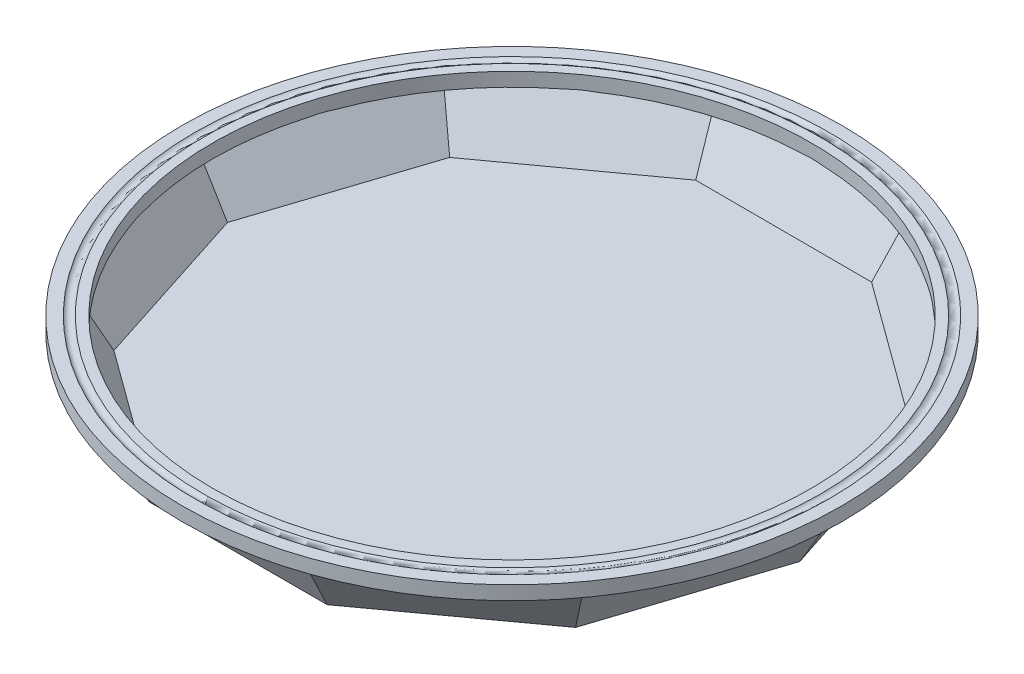
ISO-10303-21;
HEADER;
FILE_DESCRIPTION(('STEP AP214'),'2;1');
FILE_NAME('part.step','',(''),(''),'','','');
FILE_SCHEMA(('AUTOMOTIVE_DESIGN { 1 0 10303 214 1 1 1 1 }'));
ENDSEC;
DATA;
#1=APPLICATION_CONTEXT('core data for automotive mechanical design processes');
#2=APPLICATION_PROTOCOL_DEFINITION('international standard','automotive_design',2000,#1);
#3=PRODUCT_CONTEXT('',#1,'mechanical');
#4=PRODUCT('Part','Part','',(#3));
#5=PRODUCT_RELATED_PRODUCT_CATEGORY('part','',(#4));
#6=PRODUCT_DEFINITION_FORMATION('','',#4);
#7=PRODUCT_DEFINITION_CONTEXT('part definition',#1,'design');
#8=PRODUCT_DEFINITION('design','',#6,#7);
#9=PRODUCT_DEFINITION_SHAPE('','',#8);
#10=(LENGTH_UNIT() NAMED_UNIT(*) SI_UNIT(.MILLI.,.METRE.));
#11=(NAMED_UNIT(*) PLANE_ANGLE_UNIT() SI_UNIT($,.RADIAN.));
#12=(NAMED_UNIT(*) SI_UNIT($,.STERADIAN.) SOLID_ANGLE_UNIT());
#13=UNCERTAINTY_MEASURE_WITH_UNIT(LENGTH_MEASURE(1.E-05),#10,'distance_accuracy_value','');
#14=(GEOMETRIC_REPRESENTATION_CONTEXT(3) GLOBAL_UNCERTAINTY_ASSIGNED_CONTEXT((#13)) GLOBAL_UNIT_ASSIGNED_CONTEXT((#10,
#11,#12)) REPRESENTATION_CONTEXT('',''));
#15=CARTESIAN_POINT('',(0.,0.,0.));
#16=DIRECTION('',(0.,0.,1.));
#17=DIRECTION('',(1.,0.,0.));
#18=AXIS2_PLACEMENT_3D('',#15,#16,#17);
#19=CARTESIAN_POINT('',(0.,30.,0.));
#20=DIRECTION('',(0.,1.,0.));
#21=DIRECTION('',(0.,0.,1.));
#22=AXIS2_PLACEMENT_3D('',#19,#20,#21);
#23=PLANE('',#22);
#24=CARTESIAN_POINT('',(0.,30.,0.));
#25=DIRECTION('',(0.,1.,0.));
#26=DIRECTION('',(0.,0.,1.));
#27=AXIS2_PLACEMENT_3D('',#24,#25,#26);
#28=CIRCLE('',#27,143.211859946201);
#29=CARTESIAN_POINT('',(0.,30.,143.211859946201));
#30=VERTEX_POINT('',#29);
#31=EDGE_CURVE('E267',#30,#30,#28,.T.);
#32=ORIENTED_EDGE('',*,*,#31,.T.);
#33=EDGE_LOOP('',(#32));
#34=FACE_BOUND('',#33,.T.);
#35=CARTESIAN_POINT('',(0.,30.,0.));
#36=DIRECTION('',(0.,1.,0.));
#37=DIRECTION('',(0.,0.,1.));
#38=AXIS2_PLACEMENT_3D('',#35,#36,#37);
#39=CIRCLE('',#38,137.820311126304);
#40=CARTESIAN_POINT('',(137.82007156461,30.,0.256968630386883));
#41=VERTEX_POINT('',#40);
#42=EDGE_CURVE('E11',#41,#41,#39,.T.);
#43=ORIENTED_EDGE('',*,*,#42,.F.);
#44=EDGE_LOOP('',(#43));
#45=FACE_BOUND('',#44,.T.);
#46=ADVANCED_FACE('F35',(#34,#45),#23,.T.);
#47=CARTESIAN_POINT('',(101.127124296869,0.,73.4731565365584));
#48=DIRECTION('',(0.823639103546333,-0.500000000000001,0.267616567329811));
#49=DIRECTION('',(0.518927630227215,0.854818176331532,0.));
#50=AXIS2_PLACEMENT_3D('',#47,#48,#49);
#51=PLANE('',#50);
#52=DIRECTION('',(-0.309016994374941,0.,0.951056516295156));
#53=VECTOR('',#52,1.);
#54=CARTESIAN_POINT('',(114.30534995361,24.,77.7550216138354));
#55=LINE('',#54,#53);
#56=CARTESIAN_POINT('',(112.914087653391,24.,82.0368866911125));
#57=VERTEX_POINT('',#56);
#58=CARTESIAN_POINT('',(139.569487956961,24.,-1.01377953772939E-12));
#59=VERTEX_POINT('',#58);
#60=EDGE_CURVE('E363',#57,#59,#55,.F.);
#61=ORIENTED_EDGE('',*,*,#60,.F.);
#62=DIRECTION('',(-0.419821271704539,-0.854818176331531,-0.305018008054637));
#63=VECTOR('',#62,1.);
#64=CARTESIAN_POINT('',(101.127124296869,0.,73.4731565365584));
#65=LINE('',#64,#63);
#66=CARTESIAN_POINT('',(101.127124296869,0.,73.4731565365584));
#67=VERTEX_POINT('',#66);
#68=EDGE_CURVE('E454',#57,#67,#65,.T.);
#69=ORIENTED_EDGE('',*,*,#68,.T.);
#70=DIRECTION('',(0.309016994374941,0.,-0.951056516295156));
#71=VECTOR('',#70,1.);
#72=CARTESIAN_POINT('',(101.127124296869,0.,73.4731565365584));
#73=LINE('',#72,#71);
#74=CARTESIAN_POINT('',(125.,0.,-9.09773622481821E-13));
#75=VERTEX_POINT('',#74);
#76=EDGE_CURVE('E370',#67,#75,#73,.T.);
#77=ORIENTED_EDGE('',*,*,#76,.T.);
#78=DIRECTION('',(-0.518927630227216,-0.854818176331532,0.));
#79=VECTOR('',#78,1.);
#80=CARTESIAN_POINT('',(125.,0.,-9.03291499595016E-13));
#81=LINE('',#80,#79);
#82=EDGE_CURVE('E254',#59,#75,#81,.T.);
#83=ORIENTED_EDGE('',*,*,#82,.F.);
#84=EDGE_LOOP('',(#61,#69,#77,#83));
#85=FACE_BOUND('',#84,.T.);
#86=ADVANCED_FACE('F547',(#85),#51,.T.);
#87=CARTESIAN_POINT('',(125.,0.,-9.09773622481821E-13));
#88=DIRECTION('',(0.823639103546329,-0.500000000000001,-0.267616567329824));
#89=DIRECTION('',(0.518927630227217,0.854818176331531,0.));
#90=AXIS2_PLACEMENT_3D('',#87,#88,#89);
#91=PLANE('',#90);
#92=DIRECTION('',(0.309016994374955,0.,0.951056516295151));
#93=VECTOR('',#92,1.);
#94=CARTESIAN_POINT('',(138.178225656741,24.,-4.2818650772781));
#95=LINE('',#94,#93);
#96=CARTESIAN_POINT('',(112.91408765339,24.,-82.0368866911142));
#97=VERTEX_POINT('',#96);
#98=EDGE_CURVE('E360',#59,#97,#95,.F.);
#99=ORIENTED_EDGE('',*,*,#98,.F.);
#100=ORIENTED_EDGE('',*,*,#82,.T.);
#101=DIRECTION('',(-0.309016994374955,0.,-0.951056516295151));
#102=VECTOR('',#101,1.);
#103=CARTESIAN_POINT('',(125.,0.,-9.09773622481821E-13));
#104=LINE('',#103,#102);
#105=CARTESIAN_POINT('',(101.127124296868,0.,-73.4731565365599));
#106=VERTEX_POINT('',#105);
#107=EDGE_CURVE('E427',#75,#106,#104,.T.);
#108=ORIENTED_EDGE('',*,*,#107,.T.);
#109=DIRECTION('',(-0.419821271704534,-0.854818176331531,0.305018008054643));
#110=VECTOR('',#109,1.);
#111=CARTESIAN_POINT('',(101.127124296868,0.,-73.4731565365599));
#112=LINE('',#111,#110);
#113=EDGE_CURVE('E456',#97,#106,#112,.T.);
#114=ORIENTED_EDGE('',*,*,#113,.F.);
#115=EDGE_LOOP('',(#99,#100,#108,#114));
#116=FACE_BOUND('',#115,.T.);
#117=ADVANCED_FACE('F37',(#116),#91,.T.);
#118=CARTESIAN_POINT('',(101.127124296868,0.,-73.4731565365599));
#119=DIRECTION('',(0.509036960455122,-0.500000000000001,-0.70062926922204));
#120=DIRECTION('',(-0.809016994374951,0.,-0.587785252292468));
#121=AXIS2_PLACEMENT_3D('',#118,#119,#120);
#122=PLANE('',#121);
#123=DIRECTION('',(0.809016994374951,0.,0.587785252292468));
#124=VECTOR('',#123,1.);
#125=CARTESIAN_POINT('',(109.27171566415,24.,-84.6832248441126));
#126=LINE('',#125,#124);
#127=CARTESIAN_POINT('',(43.1293436749093,24.,-132.738470997446));
#128=VERTEX_POINT('',#127);
#129=EDGE_CURVE('E357',#97,#128,#126,.F.);
#130=ORIENTED_EDGE('',*,*,#129,.F.);
#131=ORIENTED_EDGE('',*,*,#113,.T.);
#132=DIRECTION('',(-0.809016994374951,0.,-0.587785252292468));
#133=VECTOR('',#132,1.);
#134=CARTESIAN_POINT('',(101.127124296868,0.,-73.4731565365599));
#135=LINE('',#134,#133);
#136=CARTESIAN_POINT('',(38.6271242968675,0.,-118.882064536895));
#137=VERTEX_POINT('',#136);
#138=EDGE_CURVE('E430',#106,#137,#135,.T.);
#139=ORIENTED_EDGE('',*,*,#138,.T.);
#140=DIRECTION('',(-0.160357456590925,-0.854818176331532,0.493529504213197));
#141=VECTOR('',#140,1.);
#142=CARTESIAN_POINT('',(38.6271242968675,0.,-118.882064536895));
#143=LINE('',#142,#141);
#144=EDGE_CURVE('E470',#128,#137,#143,.T.);
#145=ORIENTED_EDGE('',*,*,#144,.F.);
#146=EDGE_LOOP('',(#130,#131,#139,#145));
#147=FACE_BOUND('',#146,.T.);
#148=ADVANCED_FACE('F815',(#147),#122,.T.);
#149=CARTESIAN_POINT('',(38.6271242968675,0.,-118.882064536895));
#150=DIRECTION('',(0.,-0.500000000000001,-0.866025403784438));
#151=DIRECTION('',(0.,0.866025403784438,-0.500000000000001));
#152=AXIS2_PLACEMENT_3D('',#149,#150,#151);
#153=PLANE('',#152);
#154=DIRECTION('',(1.,0.,0.));
#155=VECTOR('',#154,1.);
#156=CARTESIAN_POINT('',(38.6271242968674,24.,-132.738470997446));
#157=LINE('',#156,#155);
#158=CARTESIAN_POINT('',(-43.1293436749114,24.,-132.738470997445));
#159=VERTEX_POINT('',#158);
#160=EDGE_CURVE('E354',#128,#159,#157,.F.);
#161=ORIENTED_EDGE('',*,*,#160,.F.);
#162=ORIENTED_EDGE('',*,*,#144,.T.);
#163=DIRECTION('',(-1.,0.,0.));
#164=VECTOR('',#163,1.);
#165=CARTESIAN_POINT('',(38.6271242968675,0.,-118.882064536895));
#166=LINE('',#165,#164);
#167=CARTESIAN_POINT('',(-38.6271242968694,0.,-118.882064536894));
#168=VERTEX_POINT('',#167);
#169=EDGE_CURVE('E433',#137,#168,#166,.T.);
#170=ORIENTED_EDGE('',*,*,#169,.T.);
#171=DIRECTION('',(0.160357456590933,-0.854818176331532,0.493529504213195));
#172=VECTOR('',#171,1.);
#173=CARTESIAN_POINT('',(-38.6271242968694,0.,-118.882064536894));
#174=LINE('',#173,#172);
#175=EDGE_CURVE('E468',#159,#168,#174,.T.);
#176=ORIENTED_EDGE('',*,*,#175,.F.);
#177=EDGE_LOOP('',(#161,#162,#170,#176));
#178=FACE_BOUND('',#177,.T.);
#179=ADVANCED_FACE('F805',(#178),#153,.T.);
#180=CARTESIAN_POINT('',(-38.6271242968694,0.,-118.882064536894));
#181=DIRECTION('',(-0.509036960455133,-0.500000000000001,-0.700629269222032));
#182=DIRECTION('',(-0.809016994374943,0.,0.58778525229248));
#183=AXIS2_PLACEMENT_3D('',#180,#181,#182);
#184=PLANE('',#183);
#185=DIRECTION('',(0.809016994374943,0.,-0.58778525229248));
#186=VECTOR('',#185,1.);
#187=CARTESIAN_POINT('',(-46.7717156641515,24.,-130.092132844447));
#188=LINE('',#187,#186);
#189=CARTESIAN_POINT('',(-112.914087653391,24.,-82.0368866911125));
#190=VERTEX_POINT('',#189);
#191=EDGE_CURVE('E351',#159,#190,#188,.F.);
#192=ORIENTED_EDGE('',*,*,#191,.F.);
#193=ORIENTED_EDGE('',*,*,#175,.T.);
#194=DIRECTION('',(-0.809016994374943,0.,0.58778525229248));
#195=VECTOR('',#194,1.);
#196=CARTESIAN_POINT('',(-38.6271242968694,0.,-118.882064536894));
#197=LINE('',#196,#195);
#198=CARTESIAN_POINT('',(-101.127124296869,0.,-73.4731565365584));
#199=VERTEX_POINT('',#198);
#200=EDGE_CURVE('E436',#168,#199,#197,.T.);
#201=ORIENTED_EDGE('',*,*,#200,.T.);
#202=DIRECTION('',(0.419821271704539,-0.854818176331531,0.305018008054636));
#203=VECTOR('',#202,1.);
#204=CARTESIAN_POINT('',(-101.127124296869,0.,-73.4731565365584));
#205=LINE('',#204,#203);
#206=EDGE_CURVE('E466',#190,#199,#205,.T.);
#207=ORIENTED_EDGE('',*,*,#206,.F.);
#208=EDGE_LOOP('',(#192,#193,#201,#207));
#209=FACE_BOUND('',#208,.T.);
#210=ADVANCED_FACE('F795',(#209),#184,.T.);
#211=CARTESIAN_POINT('',(-101.127124296869,0.,-73.4731565365584));
#212=DIRECTION('',(-0.823639103546333,-0.500000000000001,-0.267616567329811));
#213=DIRECTION('',(0.518927630227215,-0.854818176331532,0.));
#214=AXIS2_PLACEMENT_3D('',#211,#212,#213);
#215=PLANE('',#214);
#216=DIRECTION('',(0.309016994374941,0.,-0.951056516295156));
#217=VECTOR('',#216,1.);
#218=CARTESIAN_POINT('',(-114.30534995361,24.,-77.7550216138354));
#219=LINE('',#218,#217);
#220=CARTESIAN_POINT('',(-139.569487956961,24.,9.80287554470755E-13));
#221=VERTEX_POINT('',#220);
#222=EDGE_CURVE('E348',#190,#221,#219,.F.);
#223=ORIENTED_EDGE('',*,*,#222,.F.);
#224=ORIENTED_EDGE('',*,*,#206,.T.);
#225=DIRECTION('',(-0.309016994374941,0.,0.951056516295156));
#226=VECTOR('',#225,1.);
#227=CARTESIAN_POINT('',(-101.127124296869,0.,-73.4731565365584));
#228=LINE('',#227,#226);
#229=CARTESIAN_POINT('',(-125.,0.,8.7360674250192E-13));
#230=VERTEX_POINT('',#229);
#231=EDGE_CURVE('E439',#199,#230,#228,.T.);
#232=ORIENTED_EDGE('',*,*,#231,.T.);
#233=DIRECTION('',(0.518927630227216,-0.854818176331532,0.));
#234=VECTOR('',#233,1.);
#235=CARTESIAN_POINT('',(-125.,0.,8.7360674250192E-13));
#236=LINE('',#235,#234);
#237=EDGE_CURVE('E464',#221,#230,#236,.T.);
#238=ORIENTED_EDGE('',*,*,#237,.F.);
#239=EDGE_LOOP('',(#223,#224,#232,#238));
#240=FACE_BOUND('',#239,.T.);
#241=ADVANCED_FACE('F785',(#240),#215,.T.);
#242=CARTESIAN_POINT('',(-125.,0.,8.7360674250192E-13));
#243=DIRECTION('',(-0.823639103546329,-0.500000000000001,0.267616567329823));
#244=DIRECTION('',(0.518927630227217,-0.854818176331531,0.));
#245=AXIS2_PLACEMENT_3D('',#242,#243,#244);
#246=PLANE('',#245);
#247=DIRECTION('',(-0.309016994374954,0.,-0.951056516295151));
#248=VECTOR('',#247,1.);
#249=CARTESIAN_POINT('',(-138.178225656741,24.,4.28186507727806));
#250=LINE('',#249,#248);
#251=CARTESIAN_POINT('',(-112.91408765339,24.,82.0368866911142));
#252=VERTEX_POINT('',#251);
#253=EDGE_CURVE('E345',#221,#252,#250,.F.);
#254=ORIENTED_EDGE('',*,*,#253,.F.);
#255=ORIENTED_EDGE('',*,*,#237,.T.);
#256=DIRECTION('',(0.309016994374954,0.,0.951056516295151));
#257=VECTOR('',#256,1.);
#258=CARTESIAN_POINT('',(-125.,0.,8.7360674250192E-13));
#259=LINE('',#258,#257);
#260=CARTESIAN_POINT('',(-101.127124296868,0.,73.4731565365599));
#261=VERTEX_POINT('',#260);
#262=EDGE_CURVE('E442',#230,#261,#259,.T.);
#263=ORIENTED_EDGE('',*,*,#262,.T.);
#264=DIRECTION('',(0.419821271704535,-0.854818176331532,-0.305018008054643));
#265=VECTOR('',#264,1.);
#266=CARTESIAN_POINT('',(-101.127124296868,0.,73.4731565365599));
#267=LINE('',#266,#265);
#268=EDGE_CURVE('E462',#252,#261,#267,.T.);
#269=ORIENTED_EDGE('',*,*,#268,.F.);
#270=EDGE_LOOP('',(#254,#255,#263,#269));
#271=FACE_BOUND('',#270,.T.);
#272=ADVANCED_FACE('F775',(#271),#246,.T.);
#273=CARTESIAN_POINT('',(-101.127124296868,0.,73.4731565365599));
#274=DIRECTION('',(-0.509036960455122,-0.500000000000001,0.70062926922204));
#275=DIRECTION('',(0.809016994374951,0.,0.587785252292468));
#276=AXIS2_PLACEMENT_3D('',#273,#274,#275);
#277=PLANE('',#276);
#278=DIRECTION('',(-0.809016994374951,0.,-0.587785252292468));
#279=VECTOR('',#278,1.);
#280=CARTESIAN_POINT('',(-109.27171566415,24.,84.6832248441126));
#281=LINE('',#280,#279);
#282=CARTESIAN_POINT('',(-43.1293436749094,24.,132.738470997446));
#283=VERTEX_POINT('',#282);
#284=EDGE_CURVE('E342',#252,#283,#281,.F.);
#285=ORIENTED_EDGE('',*,*,#284,.F.);
#286=ORIENTED_EDGE('',*,*,#268,.T.);
#287=DIRECTION('',(0.809016994374951,0.,0.587785252292468));
#288=VECTOR('',#287,1.);
#289=CARTESIAN_POINT('',(-101.127124296868,0.,73.4731565365599));
#290=LINE('',#289,#288);
#291=CARTESIAN_POINT('',(-38.6271242968676,0.,118.882064536895));
#292=VERTEX_POINT('',#291);
#293=EDGE_CURVE('E445',#261,#292,#290,.T.);
#294=ORIENTED_EDGE('',*,*,#293,.T.);
#295=DIRECTION('',(0.160357456590925,-0.854818176331531,-0.493529504213197));
#296=VECTOR('',#295,1.);
#297=CARTESIAN_POINT('',(-38.6271242968676,0.,118.882064536895));
#298=LINE('',#297,#296);
#299=EDGE_CURVE('E460',#283,#292,#298,.T.);
#300=ORIENTED_EDGE('',*,*,#299,.F.);
#301=EDGE_LOOP('',(#285,#286,#294,#300));
#302=FACE_BOUND('',#301,.T.);
#303=ADVANCED_FACE('F765',(#302),#277,.T.);
#304=CARTESIAN_POINT('',(-38.6271242968676,0.,118.882064536895));
#305=DIRECTION('',(0.,-0.500000000000001,0.866025403784438));
#306=DIRECTION('',(0.,-0.866025403784438,-0.500000000000001));
#307=AXIS2_PLACEMENT_3D('',#304,#305,#306);
#308=PLANE('',#307);
#309=DIRECTION('',(-1.,0.,0.));
#310=VECTOR('',#309,1.);
#311=CARTESIAN_POINT('',(-38.6271242968675,24.,132.738470997446));
#312=LINE('',#311,#310);
#313=CARTESIAN_POINT('',(43.1293436749113,24.,132.738470997445));
#314=VERTEX_POINT('',#313);
#315=EDGE_CURVE('E339',#283,#314,#312,.F.);
#316=ORIENTED_EDGE('',*,*,#315,.F.);
#317=ORIENTED_EDGE('',*,*,#299,.T.);
#318=DIRECTION('',(1.,0.,0.));
#319=VECTOR('',#318,1.);
#320=CARTESIAN_POINT('',(-38.6271242968676,0.,118.882064536895));
#321=LINE('',#320,#319);
#322=CARTESIAN_POINT('',(38.6271242968693,0.,118.882064536894));
#323=VERTEX_POINT('',#322);
#324=EDGE_CURVE('E448',#292,#323,#321,.T.);
#325=ORIENTED_EDGE('',*,*,#324,.T.);
#326=DIRECTION('',(-0.160357456590932,-0.854818176331531,-0.493529504213195));
#327=VECTOR('',#326,1.);
#328=CARTESIAN_POINT('',(38.6271242968693,0.,118.882064536894));
#329=LINE('',#328,#327);
#330=EDGE_CURVE('E458',#314,#323,#329,.T.);
#331=ORIENTED_EDGE('',*,*,#330,.F.);
#332=EDGE_LOOP('',(#316,#317,#325,#331));
#333=FACE_BOUND('',#332,.T.);
#334=ADVANCED_FACE('F755',(#333),#308,.T.);
#335=CARTESIAN_POINT('',(38.6271242968693,0.,118.882064536894));
#336=DIRECTION('',(0.509036960455132,-0.500000000000001,0.700629269222033));
#337=DIRECTION('',(0.809016994374943,0.,-0.587785252292479));
#338=AXIS2_PLACEMENT_3D('',#335,#336,#337);
#339=PLANE('',#338);
#340=DIRECTION('',(-0.809016994374943,0.,0.587785252292479));
#341=VECTOR('',#340,1.);
#342=CARTESIAN_POINT('',(46.7717156641514,24.,130.092132844446));
#343=LINE('',#342,#341);
#344=EDGE_CURVE('E336',#314,#57,#343,.F.);
#345=ORIENTED_EDGE('',*,*,#344,.F.);
#346=ORIENTED_EDGE('',*,*,#330,.T.);
#347=DIRECTION('',(0.809016994374943,0.,-0.587785252292479));
#348=VECTOR('',#347,1.);
#349=CARTESIAN_POINT('',(38.6271242968693,0.,118.882064536894));
#350=LINE('',#349,#348);
#351=EDGE_CURVE('E451',#323,#67,#350,.T.);
#352=ORIENTED_EDGE('',*,*,#351,.T.);
#353=ORIENTED_EDGE('',*,*,#68,.F.);
#354=EDGE_LOOP('',(#345,#346,#352,#353));
#355=FACE_BOUND('',#354,.T.);
#356=ADVANCED_FACE('F750',(#355),#339,.T.);
#357=CARTESIAN_POINT('',(0.,0.,0.));
#358=DIRECTION('',(0.,1.,0.));
#359=DIRECTION('',(0.,0.,1.));
#360=AXIS2_PLACEMENT_3D('',#357,#358,#359);
#361=PLANE('',#360);
#362=ORIENTED_EDGE('',*,*,#76,.F.);
#363=ORIENTED_EDGE('',*,*,#351,.F.);
#364=ORIENTED_EDGE('',*,*,#324,.F.);
#365=ORIENTED_EDGE('',*,*,#293,.F.);
#366=ORIENTED_EDGE('',*,*,#262,.F.);
#367=ORIENTED_EDGE('',*,*,#231,.F.);
#368=ORIENTED_EDGE('',*,*,#200,.F.);
#369=ORIENTED_EDGE('',*,*,#169,.F.);
#370=ORIENTED_EDGE('',*,*,#138,.F.);
#371=ORIENTED_EDGE('',*,*,#107,.F.);
#372=EDGE_LOOP('',(#362,#363,#364,#365,#366,#367,#368,#369,#370,#371));
#373=FACE_BOUND('',#372,.T.);
#374=ADVANCED_FACE('F584',(#373),#361,.F.);
#375=CARTESIAN_POINT('',(0.,24.,0.));
#376=DIRECTION('',(0.,1.,0.));
#377=DIRECTION('',(0.,0.,1.));
#378=AXIS2_PLACEMENT_3D('',#375,#376,#377);
#379=PLANE('',#378);
#380=CARTESIAN_POINT('',(0.,24.,0.));
#381=DIRECTION('',(0.,1.,0.));
#382=DIRECTION('',(0.,0.,1.));
#383=AXIS2_PLACEMENT_3D('',#380,#381,#382);
#384=CIRCLE('',#383,143.211859946201);
#385=CARTESIAN_POINT('',(0.,24.,143.211859946201));
#386=VERTEX_POINT('',#385);
#387=EDGE_CURVE('E272',#386,#386,#384,.T.);
#388=ORIENTED_EDGE('',*,*,#387,.F.);
#389=EDGE_LOOP('',(#388));
#390=FACE_BOUND('',#389,.T.);
#391=ORIENTED_EDGE('',*,*,#344,.T.);
#392=ORIENTED_EDGE('',*,*,#60,.T.);
#393=ORIENTED_EDGE('',*,*,#98,.T.);
#394=ORIENTED_EDGE('',*,*,#129,.T.);
#395=ORIENTED_EDGE('',*,*,#160,.T.);
#396=ORIENTED_EDGE('',*,*,#191,.T.);
#397=ORIENTED_EDGE('',*,*,#222,.T.);
#398=ORIENTED_EDGE('',*,*,#253,.T.);
#399=ORIENTED_EDGE('',*,*,#284,.T.);
#400=ORIENTED_EDGE('',*,*,#315,.T.);
#401=EDGE_LOOP('',(#391,#392,#393,#394,#395,#396,#397,#398,#399,#400));
#402=FACE_BOUND('',#401,.T.);
#403=ADVANCED_FACE('F541',(#390,#402),#379,.F.);
#404=CARTESIAN_POINT('',(0.,24.,0.));
#405=DIRECTION('',(0.,1.,0.));
#406=DIRECTION('',(0.,0.,1.));
#407=AXIS2_PLACEMENT_3D('',#404,#405,#406);
#408=CYLINDRICAL_SURFACE('',#407,143.211859946201);
#409=ORIENTED_EDGE('',*,*,#387,.T.);
#410=EDGE_LOOP('',(#409));
#411=FACE_BOUND('',#410,.T.);
#412=ORIENTED_EDGE('',*,*,#31,.F.);
#413=EDGE_LOOP('',(#412));
#414=FACE_BOUND('',#413,.T.);
#415=ADVANCED_FACE('F573',(#411,#414),#408,.T.);
#416=CARTESIAN_POINT('',(0.,31.5,0.));
#417=DIRECTION('',(0.,1.,0.));
#418=DIRECTION('',(0.,0.,1.));
#419=AXIS2_PLACEMENT_3D('',#416,#417,#418);
#420=TOROIDAL_SURFACE('',#419,135.972501612311,2.38);
#421=ORIENTED_EDGE('',*,*,#42,.T.);
#422=CARTESIAN_POINT('',(135.972265262513,31.5,0.253523353880496));
#423=DIRECTION('',(0.00186451930261126,0.,-0.999998261782374));
#424=DIRECTION('',(-0.999998261782374,0.,-0.00186451930261126));
#425=AXIS2_PLACEMENT_3D('',#422,#423,#424);
#426=CIRCLE('',#425,2.38);
#427=CARTESIAN_POINT('',(134.124458960415,30.,0.250078077374109));
#428=VERTEX_POINT('',#427);
#429=EDGE_CURVE('E49',#41,#428,#426,.T.);
#430=ORIENTED_EDGE('',*,*,#429,.T.);
#431=CARTESIAN_POINT('',(0.,30.,0.));
#432=DIRECTION('',(0.,-1.,0.));
#433=DIRECTION('',(0.,0.,-1.));
#434=AXIS2_PLACEMENT_3D('',#431,#432,#433);
#435=CIRCLE('',#434,134.124692098319);
#436=EDGE_CURVE('E43',#428,#428,#435,.T.);
#437=ORIENTED_EDGE('',*,*,#436,.T.);
#438=ORIENTED_EDGE('',*,*,#429,.F.);
#439=EDGE_LOOP('',(#421,#430,#437,#438));
#440=FACE_BOUND('',#439,.T.);
#441=ADVANCED_FACE('F571',(#440),#420,.F.);
#442=CARTESIAN_POINT('',(0.,3.,0.));
#443=DIRECTION('',(0.,1.,0.));
#444=DIRECTION('',(0.,0.,1.));
#445=AXIS2_PLACEMENT_3D('',#442,#443,#444);
#446=PLANE('',#445);
#447=DIRECTION('',(-0.310789720468668,0.,0.950478695001107));
#448=VECTOR('',#447,1.);
#449=CARTESIAN_POINT('',(-111.939808516661,3.,-36.6023373076961));
#450=LINE('',#449,#448);
#451=CARTESIAN_POINT('',(-100.04698819723,3.,-72.9737858872992));
#452=VERTEX_POINT('',#451);
#453=CARTESIAN_POINT('',(-123.832628836092,3.,-0.23088872809286));
#454=VERTEX_POINT('',#453);
#455=EDGE_CURVE('E366',#452,#454,#450,.T.);
#456=ORIENTED_EDGE('',*,*,#455,.T.);
#457=DIRECTION('',(0.307243194003655,0.,0.951631031302801));
#458=VECTOR('',#457,1.);
#459=CARTESIAN_POINT('',(-112.075521505955,3.,36.1846556747665));
#460=LINE('',#459,#458);
#461=CARTESIAN_POINT('',(-100.318414175817,3.,72.6002000776257));
#462=VERTEX_POINT('',#461);
#463=EDGE_CURVE('E399',#454,#462,#460,.T.);
#464=ORIENTED_EDGE('',*,*,#463,.T.);
#465=DIRECTION('',(0.807919651178659,0.,0.58929265839594));
#466=VECTOR('',#465,1.);
#467=CARTESIAN_POINT('',(-69.4021945868432,3.,95.1503400606799));
#468=LINE('',#467,#466);
#469=CARTESIAN_POINT('',(-38.4859749978693,3.,117.700480043734));
#470=VERTEX_POINT('',#469);
#471=EDGE_CURVE('E420',#462,#470,#468,.T.);
#472=ORIENTED_EDGE('',*,*,#471,.T.);
#473=DIRECTION('',(0.999998261782374,0.,0.00186451930261108));
#474=VECTOR('',#473,1.);
#475=CARTESIAN_POINT('',(-0.21958822939178,3.,117.771828584524));
#476=LINE('',#475,#474);
#477=CARTESIAN_POINT('',(38.0467985390857,3.,117.843177125315));
#478=VERTEX_POINT('',#477);
#479=EDGE_CURVE('E417',#470,#478,#476,.T.);
#480=ORIENTED_EDGE('',*,*,#479,.T.);
#481=DIRECTION('',(0.810111525076038,0.,-0.586275802791635));
#482=VECTOR('',#481,1.);
#483=CARTESIAN_POINT('',(69.0468933681579,3.,95.4084815063069));
#484=LINE('',#483,#482);
#485=CARTESIAN_POINT('',(100.04698819723,3.,72.9737858872992));
#486=VERTEX_POINT('',#485);
#487=EDGE_CURVE('E414',#478,#486,#484,.T.);
#488=ORIENTED_EDGE('',*,*,#487,.T.);
#489=DIRECTION('',(0.310789720468668,0.,-0.950478695001107));
#490=VECTOR('',#489,1.);
#491=CARTESIAN_POINT('',(111.939808516661,3.,36.602337307696));
#492=LINE('',#491,#490);
#493=CARTESIAN_POINT('',(123.832628836092,3.,0.230888728092846));
#494=VERTEX_POINT('',#493);
#495=EDGE_CURVE('E411',#486,#494,#492,.T.);
#496=ORIENTED_EDGE('',*,*,#495,.T.);
#497=DIRECTION('',(-0.307243194003654,0.,-0.951631031302801));
#498=VECTOR('',#497,1.);
#499=CARTESIAN_POINT('',(112.075521505954,3.,-36.1846556747664));
#500=LINE('',#499,#498);
#501=CARTESIAN_POINT('',(100.318414175817,3.,-72.6002000776257));
#502=VERTEX_POINT('',#501);
#503=EDGE_CURVE('E408',#494,#502,#500,.T.);
#504=ORIENTED_EDGE('',*,*,#503,.T.);
#505=DIRECTION('',(-0.807919651178659,0.,-0.58929265839594));
#506=VECTOR('',#505,1.);
#507=CARTESIAN_POINT('',(69.4021945868432,3.,-95.1503400606799));
#508=LINE('',#507,#506);
#509=CARTESIAN_POINT('',(38.4859749978693,3.,-117.700480043734));
#510=VERTEX_POINT('',#509);
#511=EDGE_CURVE('E405',#502,#510,#508,.T.);
#512=ORIENTED_EDGE('',*,*,#511,.T.);
#513=DIRECTION('',(-0.999998261782374,0.,-0.0018645193026114));
#514=VECTOR('',#513,1.);
#515=CARTESIAN_POINT('',(0.219588229391817,3.,-117.771828584524));
#516=LINE('',#515,#514);
#517=CARTESIAN_POINT('',(-38.0467985390858,3.,-117.843177125315));
#518=VERTEX_POINT('',#517);
#519=EDGE_CURVE('E402',#510,#518,#516,.T.);
#520=ORIENTED_EDGE('',*,*,#519,.T.);
#521=DIRECTION('',(-0.810111525076038,0.,0.586275802791635));
#522=VECTOR('',#521,1.);
#523=CARTESIAN_POINT('',(-69.0468933681579,3.,-95.408481506307));
#524=LINE('',#523,#522);
#525=EDGE_CURVE('E374',#518,#452,#524,.T.);
#526=ORIENTED_EDGE('',*,*,#525,.T.);
#527=EDGE_LOOP('',(#456,#464,#472,#480,#488,#496,#504,#512,#520,#526));
#528=FACE_BOUND('',#527,.T.);
#529=ADVANCED_FACE('F480',(#528),#446,.T.);
#530=CARTESIAN_POINT('',(-140.223274297114,30.,-0.261449456058382));
#531=DIRECTION('',(-0.824136648137809,-0.500000000000001,0.266080411147035));
#532=DIRECTION('',(0.51869865263989,-0.854957137960472,0.));
#533=AXIS2_PLACEMENT_3D('',#530,#531,#532);
#534=PLANE('',#533);
#535=DIRECTION('',(-0.307243194003655,0.,-0.951631031302801));
#536=VECTOR('',#535,1.);
#537=CARTESIAN_POINT('',(-136.926727704563,24.,-1.32577110064653));
#538=LINE('',#537,#536);
#539=CARTESIAN_POINT('',(-110.645960520659,24.,80.0742210448271));
#540=VERTEX_POINT('',#539);
#541=CARTESIAN_POINT('',(-122.019078106485,24.,44.8480164337667));
#542=VERTEX_POINT('',#541);
#543=EDGE_CURVE('E243',#540,#542,#538,.T.);
#544=ORIENTED_EDGE('',*,*,#543,.F.);
#545=DIRECTION('',(-0.420389253927465,0.854818176331532,0.304234713002222));
#546=VECTOR('',#545,1.);
#547=CARTESIAN_POINT('',(-107.754520823724,18.1205556859161,77.9816929458292));
#548=LINE('',#547,#546);
#549=EDGE_CURVE('E373',#462,#540,#548,.T.);
#550=ORIENTED_EDGE('',*,*,#549,.F.);
#551=ORIENTED_EDGE('',*,*,#463,.F.);
#552=DIRECTION('',(-0.518926728218063,0.854818176331532,-0.000967550583216952));
#553=VECTOR('',#552,1.);
#554=CARTESIAN_POINT('',(-133.011727629481,18.1205556859161,-0.248003364722665));
#555=LINE('',#554,#553);
#556=CARTESIAN_POINT('',(-136.580908639109,24.,-0.254658183177153));
#557=VERTEX_POINT('',#556);
#558=EDGE_CURVE('E239',#454,#557,#555,.T.);
#559=ORIENTED_EDGE('',*,*,#558,.T.);
#560=CARTESIAN_POINT('',(-125.207791053282,24.,34.9715464278832));
#561=VERTEX_POINT('',#560);
#562=EDGE_CURVE('E233',#561,#557,#538,.T.);
#563=ORIENTED_EDGE('',*,*,#562,.F.);
#564=CARTESIAN_POINT('',(0.,-200.98714538274,0.));
#565=DIRECTION('',(-0.824136648137809,-0.500000000000001,0.266080411147035));
#566=DIRECTION('',(-0.475815515651402,0.866025403784438,0.153621597001828));
#567=AXIS2_PLACEMENT_3D('',#564,#565,#566);
#568=ELLIPSE('',#567,259.999999999999,130.);
#569=EDGE_CURVE('E236',#542,#561,#568,.T.);
#570=ORIENTED_EDGE('',*,*,#569,.F.);
#571=EDGE_LOOP('',(#544,#550,#551,#559,#563,#570));
#572=FACE_BOUND('',#571,.T.);
#573=ADVANCED_FACE('F235',(#572),#534,.F.);
#574=CARTESIAN_POINT('',(0.,24.,0.));
#575=DIRECTION('',(0.,1.,0.));
#576=DIRECTION('',(0.,0.,1.));
#577=AXIS2_PLACEMENT_3D('',#574,#575,#576);
#578=CIRCLE('',#577,130.);
#579=CARTESIAN_POINT('',(-80.7394715500822,24.,101.887868432966));
#580=VERTEX_POINT('',#579);
#581=EDGE_CURVE('E253',#542,#580,#578,.T.);
#582=ORIENTED_EDGE('',*,*,#581,.T.);
#583=DIRECTION('',(-0.807919651178659,0.,-0.58929265839594));
#584=VECTOR('',#583,1.);
#585=CARTESIAN_POINT('',(-111.555318398018,24.,79.410939838335));
#586=LINE('',#585,#584);
#587=EDGE_CURVE('E303',#580,#540,#586,.T.);
#588=ORIENTED_EDGE('',*,*,#587,.T.);
#589=ORIENTED_EDGE('',*,*,#543,.T.);
#590=EDGE_LOOP('',(#582,#588,#589));
#591=FACE_BOUND('',#590,.T.);
#592=ADVANCED_FACE('F474',(#591),#379,.F.);
#593=CARTESIAN_POINT('',(-113.596688047756,30.,82.2096556068846));
#594=DIRECTION('',(-0.510342412434549,-0.500000000000001,0.69967894213738));
#595=DIRECTION('',(0.807919651178659,0.,0.58929265839594));
#596=AXIS2_PLACEMENT_3D('',#593,#594,#595);
#597=PLANE('',#596);
#598=CARTESIAN_POINT('',(-42.4480162011953,24.,129.817469456379));
#599=VERTEX_POINT('',#598);
#600=CARTESIAN_POINT('',(-72.3545051717717,24.,108.00382206824));
#601=VERTEX_POINT('',#600);
#602=EDGE_CURVE('E307',#599,#601,#586,.T.);
#603=ORIENTED_EDGE('',*,*,#602,.F.);
#604=DIRECTION('',(-0.161277373141785,0.854818176331531,0.493229656778382));
#605=VECTOR('',#604,1.);
#606=CARTESIAN_POINT('',(-41.3387495047638,18.1205556859161,126.425033051332));
#607=LINE('',#606,#605);
#608=EDGE_CURVE('E377',#470,#599,#607,.T.);
#609=ORIENTED_EDGE('',*,*,#608,.F.);
#610=ORIENTED_EDGE('',*,*,#471,.F.);
#611=ORIENTED_EDGE('',*,*,#549,.T.);
#612=ORIENTED_EDGE('',*,*,#587,.F.);
#613=CARTESIAN_POINT('',(0.,-200.98714538274,0.));
#614=DIRECTION('',(-0.510342412434549,-0.500000000000001,0.69967894213738));
#615=DIRECTION('',(-0.294646329197971,0.866025403784438,0.40395982558933));
#616=AXIS2_PLACEMENT_3D('',#613,#614,#615);
#617=ELLIPSE('',#616,259.999999999999,130.);
#618=EDGE_CURVE('E275',#601,#580,#617,.T.);
#619=ORIENTED_EDGE('',*,*,#618,.F.);
#620=EDGE_LOOP('',(#603,#609,#610,#611,#612,#619));
#621=FACE_BOUND('',#620,.T.);
#622=ADVANCED_FACE('F477',(#621),#597,.F.);
#623=CARTESIAN_POINT('',(-5.43141814845509,24.,129.886487737935));
#624=VERTEX_POINT('',#623);
#625=EDGE_CURVE('E262',#601,#624,#578,.T.);
#626=ORIENTED_EDGE('',*,*,#625,.T.);
#627=DIRECTION('',(-0.999998261782374,0.,-0.00186451930261108));
#628=VECTOR('',#627,1.);
#629=CARTESIAN_POINT('',(-43.5735690892465,24.,129.815370837646));
#630=LINE('',#629,#628);
#631=EDGE_CURVE('E308',#624,#599,#630,.T.);
#632=ORIENTED_EDGE('',*,*,#631,.T.);
#633=ORIENTED_EDGE('',*,*,#602,.T.);
#634=EDGE_LOOP('',(#626,#632,#633));
#635=FACE_BOUND('',#634,.T.);
#636=ADVANCED_FACE('F594',(#635),#379,.F.);
#637=CARTESIAN_POINT('',(-43.5800279735741,30.,133.279466431421));
#638=DIRECTION('',(-0.00161472108190764,-0.500000000000001,0.866023898443817));
#639=DIRECTION('',(0.,-0.866025027448547,-0.500000651832319));
#640=AXIS2_PLACEMENT_3D('',#637,#638,#639);
#641=PLANE('',#640);
#642=CARTESIAN_POINT('',(41.9636275521182,24.,129.974856869096));
#643=VERTEX_POINT('',#642);
#644=CARTESIAN_POINT('',(4.94702949937811,24.,129.905838587541));
#645=VERTEX_POINT('',#644);
#646=EDGE_CURVE('E311',#643,#645,#630,.T.);
#647=ORIENTED_EDGE('',*,*,#646,.F.);
#648=DIRECTION('',(0.159436982567757,0.854818176331532,0.493827635924645));
#649=VECTOR('',#648,1.);
#650=CARTESIAN_POINT('',(40.8670190725986,18.1205556859161,126.578307560055));
#651=LINE('',#650,#649);
#652=EDGE_CURVE('E380',#478,#643,#651,.T.);
#653=ORIENTED_EDGE('',*,*,#652,.F.);
#654=ORIENTED_EDGE('',*,*,#479,.F.);
#655=ORIENTED_EDGE('',*,*,#608,.T.);
#656=ORIENTED_EDGE('',*,*,#631,.F.);
#657=CARTESIAN_POINT('',(0.,-200.98714538274,0.));
#658=DIRECTION('',(-0.00161472108190764,-0.500000000000001,0.866023898443817));
#659=DIRECTION('',(-0.000932259651305541,0.866025403784438,0.499999130891188));
#660=AXIS2_PLACEMENT_3D('',#657,#658,#659);
#661=ELLIPSE('',#660,259.999999999999,130.);
#662=EDGE_CURVE('E279',#645,#624,#661,.T.);
#663=ORIENTED_EDGE('',*,*,#662,.F.);
#664=EDGE_LOOP('',(#647,#653,#654,#655,#656,#663));
#665=FACE_BOUND('',#664,.T.);
#666=ADVANCED_FACE('F595',(#665),#641,.F.);
#667=CARTESIAN_POINT('',(71.9512523787672,24.,108.272883406359));
#668=VERTEX_POINT('',#667);
#669=EDGE_CURVE('E263',#645,#668,#578,.T.);
#670=ORIENTED_EDGE('',*,*,#669,.T.);
#671=DIRECTION('',(-0.810111525076038,0.,0.586275802791635));
#672=VECTOR('',#671,1.);
#673=CARTESIAN_POINT('',(41.0518026004751,24.,130.634742439148));
#674=LINE('',#673,#672);
#675=EDGE_CURVE('E312',#668,#643,#674,.T.);
#676=ORIENTED_EDGE('',*,*,#675,.T.);
#677=ORIENTED_EDGE('',*,*,#646,.T.);
#678=EDGE_LOOP('',(#670,#676,#677));
#679=FACE_BOUND('',#678,.T.);
#680=ADVANCED_FACE('F598',(#679),#379,.F.);
#681=CARTESIAN_POINT('',(43.0827215558418,30.,133.441051081605));
#682=DIRECTION('',(0.507729738841671,-0.500000000000001,0.701577160614403));
#683=DIRECTION('',(0.810111525076038,0.,-0.586275802791635));
#684=AXIS2_PLACEMENT_3D('',#681,#682,#683);
#685=PLANE('',#684);
#686=CARTESIAN_POINT('',(110.346591871764,24.,80.486266640721));
#687=VERTEX_POINT('',#686);
#688=CARTESIAN_POINT('',(80.3589670451154,24.,102.188240103458));
#689=VERTEX_POINT('',#688);
#690=EDGE_CURVE('E315',#687,#689,#674,.T.);
#691=ORIENTED_EDGE('',*,*,#690,.F.);
#692=DIRECTION('',(0.419251830000141,0.854818176331532,0.305800242731702));
#693=VECTOR('',#692,1.);
#694=CARTESIAN_POINT('',(107.462975383119,18.1205556859161,78.3829708192748));
#695=LINE('',#694,#693);
#696=EDGE_CURVE('E383',#486,#687,#695,.T.);
#697=ORIENTED_EDGE('',*,*,#696,.F.);
#698=ORIENTED_EDGE('',*,*,#487,.F.);
#699=ORIENTED_EDGE('',*,*,#652,.T.);
#700=ORIENTED_EDGE('',*,*,#675,.F.);
#701=CARTESIAN_POINT('',(0.,-200.98714538274,0.));
#702=DIRECTION('',(0.507729738841671,-0.500000000000001,0.701577160614403));
#703=DIRECTION('',(0.293137901395818,0.866025403784438,0.40505576253802));
#704=AXIS2_PLACEMENT_3D('',#701,#702,#703);
#705=ELLIPSE('',#704,259.999999999999,130.);
#706=EDGE_CURVE('E282',#689,#668,#705,.T.);
#707=ORIENTED_EDGE('',*,*,#706,.F.);
#708=EDGE_LOOP('',(#691,#697,#698,#699,#700,#707));
#709=FACE_BOUND('',#708,.T.);
#710=ADVANCED_FACE('F600',(#709),#685,.F.);
#711=CARTESIAN_POINT('',(121.850990030423,24.,45.3027176735089));
#712=VERTEX_POINT('',#711);
#713=EDGE_CURVE('E268',#689,#712,#578,.T.);
#714=ORIENTED_EDGE('',*,*,#713,.T.);
#715=DIRECTION('',(-0.310789720468668,0.,0.950478695001107));
#716=VECTOR('',#715,1.);
#717=CARTESIAN_POINT('',(109.996780996267,24.,81.5560825404835));
#718=LINE('',#717,#716);
#719=EDGE_CURVE('E316',#712,#687,#718,.T.);
#720=ORIENTED_EDGE('',*,*,#719,.T.);
#721=ORIENTED_EDGE('',*,*,#690,.T.);
#722=EDGE_LOOP('',(#714,#720,#721));
#723=FACE_BOUND('',#722,.T.);
#724=ADVANCED_FACE('F516',(#723),#379,.F.);
#725=CARTESIAN_POINT('',(113.289335778774,30.,82.6326897131272));
#726=DIRECTION('',(0.82313869562684,-0.500000000000001,0.26915179316093));
#727=DIRECTION('',(0.519158091946245,0.854678229257499,0.));
#728=AXIS2_PLACEMENT_3D('',#725,#726,#727);
#729=PLANE('',#728);
#730=CARTESIAN_POINT('',(136.580908639109,24.,0.254658183177143));
#731=VERTEX_POINT('',#730);
#732=CARTESIAN_POINT('',(125.07651048045,24.,35.4382071503892));
#733=VERTEX_POINT('',#732);
#734=EDGE_CURVE('E319',#731,#733,#718,.T.);
#735=ORIENTED_EDGE('',*,*,#734,.F.);
#736=DIRECTION('',(0.518926728218063,0.854818176331532,0.000967550583216953));
#737=VECTOR('',#736,1.);
#738=CARTESIAN_POINT('',(133.011727629481,18.1205556859161,0.248003364722638));
#739=LINE('',#738,#737);
#740=EDGE_CURVE('E386',#494,#731,#739,.T.);
#741=ORIENTED_EDGE('',*,*,#740,.F.);
#742=ORIENTED_EDGE('',*,*,#495,.F.);
#743=ORIENTED_EDGE('',*,*,#696,.T.);
#744=ORIENTED_EDGE('',*,*,#719,.F.);
#745=CARTESIAN_POINT('',(0.,-200.98714538274,0.));
#746=DIRECTION('',(0.82313869562684,-0.500000000000001,0.26915179316093));
#747=DIRECTION('',(0.475239347500555,0.866025403784438,0.155394860234334));
#748=AXIS2_PLACEMENT_3D('',#745,#746,#747);
#749=ELLIPSE('',#748,259.999999999999,130.);
#750=EDGE_CURVE('E285',#733,#712,#749,.T.);
#751=ORIENTED_EDGE('',*,*,#750,.F.);
#752=EDGE_LOOP('',(#735,#741,#742,#743,#744,#751));
#753=FACE_BOUND('',#752,.T.);
#754=ADVANCED_FACE('F519',(#753),#729,.F.);
#755=CARTESIAN_POINT('',(125.207791053283,24.,-34.9715464278814));
#756=VERTEX_POINT('',#755);
#757=EDGE_CURVE('E504',#733,#756,#578,.T.);
#758=ORIENTED_EDGE('',*,*,#757,.T.);
#759=DIRECTION('',(0.307243194003654,0.,0.951631031302801));
#760=VECTOR('',#759,1.);
#761=CARTESIAN_POINT('',(136.926727704563,24.,1.32577110064653));
#762=LINE('',#761,#760);
#763=EDGE_CURVE('E320',#756,#731,#762,.T.);
#764=ORIENTED_EDGE('',*,*,#763,.T.);
#765=ORIENTED_EDGE('',*,*,#734,.T.);
#766=EDGE_LOOP('',(#758,#764,#765));
#767=FACE_BOUND('',#766,.T.);
#768=ADVANCED_FACE('F520',(#767),#379,.F.);
#769=CARTESIAN_POINT('',(140.223274297114,30.,0.261449456058384));
#770=DIRECTION('',(0.82413664813781,-0.500000000000001,-0.266080411147035));
#771=DIRECTION('',(0.51869865263989,0.854957137960473,0.));
#772=AXIS2_PLACEMENT_3D('',#769,#770,#771);
#773=PLANE('',#772);
#774=CARTESIAN_POINT('',(110.645960520659,24.,-80.0742210448271));
#775=VERTEX_POINT('',#774);
#776=CARTESIAN_POINT('',(122.019078106485,24.,-44.8480164337684));
#777=VERTEX_POINT('',#776);
#778=EDGE_CURVE('E323',#775,#777,#762,.T.);
#779=ORIENTED_EDGE('',*,*,#778,.F.);
#780=DIRECTION('',(0.420389253927465,0.854818176331532,-0.304234713002222));
#781=VECTOR('',#780,1.);
#782=CARTESIAN_POINT('',(107.754520823724,18.1205556859161,-77.9816929458292));
#783=LINE('',#782,#781);
#784=EDGE_CURVE('E389',#502,#775,#783,.T.);
#785=ORIENTED_EDGE('',*,*,#784,.F.);
#786=ORIENTED_EDGE('',*,*,#503,.F.);
#787=ORIENTED_EDGE('',*,*,#740,.T.);
#788=ORIENTED_EDGE('',*,*,#763,.F.);
#789=CARTESIAN_POINT('',(0.,-200.98714538274,0.));
#790=DIRECTION('',(0.82413664813781,-0.500000000000001,-0.266080411147035));
#791=DIRECTION('',(0.475815515651402,0.866025403784438,-0.153621597001827));
#792=AXIS2_PLACEMENT_3D('',#789,#790,#791);
#793=ELLIPSE('',#792,259.999999999999,130.);
#794=EDGE_CURVE('E288',#777,#756,#793,.T.);
#795=ORIENTED_EDGE('',*,*,#794,.F.);
#796=EDGE_LOOP('',(#779,#785,#786,#787,#788,#795));
#797=FACE_BOUND('',#796,.T.);
#798=ADVANCED_FACE('F522',(#797),#773,.F.);
#799=CARTESIAN_POINT('',(80.7394715500832,24.,-101.887868432966));
#800=VERTEX_POINT('',#799);
#801=EDGE_CURVE('E499',#777,#800,#578,.T.);
#802=ORIENTED_EDGE('',*,*,#801,.T.);
#803=DIRECTION('',(0.807919651178659,0.,0.58929265839594));
#804=VECTOR('',#803,1.);
#805=CARTESIAN_POINT('',(111.555318398018,24.,-79.410939838335));
#806=LINE('',#805,#804);
#807=EDGE_CURVE('E324',#800,#775,#806,.T.);
#808=ORIENTED_EDGE('',*,*,#807,.T.);
#809=ORIENTED_EDGE('',*,*,#778,.T.);
#810=EDGE_LOOP('',(#802,#808,#809));
#811=FACE_BOUND('',#810,.T.);
#812=ADVANCED_FACE('F532',(#811),#379,.F.);
#813=CARTESIAN_POINT('',(113.596688047756,30.,-82.2096556068846));
#814=DIRECTION('',(0.510342412434549,-0.500000000000001,-0.69967894213738));
#815=DIRECTION('',(-0.807919651178659,0.,-0.58929265839594));
#816=AXIS2_PLACEMENT_3D('',#813,#814,#815);
#817=PLANE('',#816);
#818=CARTESIAN_POINT('',(42.4480162011953,24.,-129.817469456379));
#819=VERTEX_POINT('',#818);
#820=CARTESIAN_POINT('',(72.3545051717706,24.,-108.003822068241));
#821=VERTEX_POINT('',#820);
#822=EDGE_CURVE('E327',#819,#821,#806,.T.);
#823=ORIENTED_EDGE('',*,*,#822,.F.);
#824=DIRECTION('',(0.161277373141785,0.854818176331532,-0.493229656778382));
#825=VECTOR('',#824,1.);
#826=CARTESIAN_POINT('',(41.3387495047638,18.1205556859161,-126.425033051332));
#827=LINE('',#826,#825);
#828=EDGE_CURVE('E392',#510,#819,#827,.T.);
#829=ORIENTED_EDGE('',*,*,#828,.F.);
#830=ORIENTED_EDGE('',*,*,#511,.F.);
#831=ORIENTED_EDGE('',*,*,#784,.T.);
#832=ORIENTED_EDGE('',*,*,#807,.F.);
#833=CARTESIAN_POINT('',(0.,-200.98714538274,0.));
#834=DIRECTION('',(0.510342412434549,-0.500000000000001,-0.69967894213738));
#835=DIRECTION('',(0.294646329197971,0.866025403784438,-0.40395982558933));
#836=AXIS2_PLACEMENT_3D('',#833,#834,#835);
#837=ELLIPSE('',#836,259.999999999999,130.);
#838=EDGE_CURVE('E291',#821,#800,#837,.T.);
#839=ORIENTED_EDGE('',*,*,#838,.F.);
#840=EDGE_LOOP('',(#823,#829,#830,#831,#832,#839));
#841=FACE_BOUND('',#840,.T.);
#842=ADVANCED_FACE('F525',(#841),#817,.F.);
#843=CARTESIAN_POINT('',(5.43141814845624,24.,-129.886487737935));
#844=VERTEX_POINT('',#843);
#845=EDGE_CURVE('E497',#821,#844,#578,.T.);
#846=ORIENTED_EDGE('',*,*,#845,.T.);
#847=DIRECTION('',(0.999998261782374,0.,0.0018645193026114));
#848=VECTOR('',#847,1.);
#849=CARTESIAN_POINT('',(43.5735690892465,24.,-129.815370837646));
#850=LINE('',#849,#848);
#851=EDGE_CURVE('E328',#844,#819,#850,.T.);
#852=ORIENTED_EDGE('',*,*,#851,.T.);
#853=ORIENTED_EDGE('',*,*,#822,.T.);
#854=EDGE_LOOP('',(#846,#852,#853));
#855=FACE_BOUND('',#854,.T.);
#856=ADVANCED_FACE('F526',(#855),#379,.F.);
#857=CARTESIAN_POINT('',(43.5800279735741,30.,-133.279466431421));
#858=DIRECTION('',(0.00161472108190791,-0.500000000000001,-0.866023898443817));
#859=DIRECTION('',(0.,0.866025027448547,-0.500000651832319));
#860=AXIS2_PLACEMENT_3D('',#857,#858,#859);
#861=PLANE('',#860);
#862=CARTESIAN_POINT('',(-41.9636275521184,24.,-129.974856869096));
#863=VERTEX_POINT('',#862);
#864=CARTESIAN_POINT('',(-4.94702949937919,24.,-129.905838587541));
#865=VERTEX_POINT('',#864);
#866=EDGE_CURVE('E331',#863,#865,#850,.T.);
#867=ORIENTED_EDGE('',*,*,#866,.F.);
#868=DIRECTION('',(-0.159436982567757,0.854818176331531,-0.493827635924645));
#869=VECTOR('',#868,1.);
#870=CARTESIAN_POINT('',(-40.8670190725987,18.1205556859161,-126.578307560055));
#871=LINE('',#870,#869);
#872=EDGE_CURVE('E371',#518,#863,#871,.T.);
#873=ORIENTED_EDGE('',*,*,#872,.F.);
#874=ORIENTED_EDGE('',*,*,#519,.F.);
#875=ORIENTED_EDGE('',*,*,#828,.T.);
#876=ORIENTED_EDGE('',*,*,#851,.F.);
#877=CARTESIAN_POINT('',(0.,-200.98714538274,0.));
#878=DIRECTION('',(0.00161472108190791,-0.500000000000001,-0.866023898443817));
#879=DIRECTION('',(0.0009322596513057,0.866025403784438,-0.499999130891188));
#880=AXIS2_PLACEMENT_3D('',#877,#878,#879);
#881=ELLIPSE('',#880,259.999999999999,130.);
#882=EDGE_CURVE('E294',#865,#844,#881,.T.);
#883=ORIENTED_EDGE('',*,*,#882,.F.);
#884=EDGE_LOOP('',(#867,#873,#874,#875,#876,#883));
#885=FACE_BOUND('',#884,.T.);
#886=ADVANCED_FACE('F528',(#885),#861,.F.);
#887=CARTESIAN_POINT('',(-71.9512523787689,24.,-108.272883406358));
#888=VERTEX_POINT('',#887);
#889=EDGE_CURVE('E261',#865,#888,#578,.T.);
#890=ORIENTED_EDGE('',*,*,#889,.T.);
#891=DIRECTION('',(0.810111525076038,0.,-0.586275802791635));
#892=VECTOR('',#891,1.);
#893=CARTESIAN_POINT('',(-41.0518026004752,24.,-130.634742439148));
#894=LINE('',#893,#892);
#895=EDGE_CURVE('E332',#888,#863,#894,.T.);
#896=ORIENTED_EDGE('',*,*,#895,.T.);
#897=ORIENTED_EDGE('',*,*,#866,.T.);
#898=EDGE_LOOP('',(#890,#896,#897));
#899=FACE_BOUND('',#898,.T.);
#900=ADVANCED_FACE('F496',(#899),#379,.F.);
#901=CARTESIAN_POINT('',(-43.0827215558419,30.,-133.441051081605));
#902=DIRECTION('',(-0.507729738841671,-0.500000000000001,-0.701577160614403));
#903=DIRECTION('',(-0.810111525076038,0.,0.586275802791635));
#904=AXIS2_PLACEMENT_3D('',#901,#902,#903);
#905=PLANE('',#904);
#906=CARTESIAN_POINT('',(-110.346591871764,24.,-80.486266640721));
#907=VERTEX_POINT('',#906);
#908=CARTESIAN_POINT('',(-80.3589670451138,24.,-102.18824010346));
#909=VERTEX_POINT('',#908);
#910=EDGE_CURVE('E335',#907,#909,#894,.T.);
#911=ORIENTED_EDGE('',*,*,#910,.F.);
#912=DIRECTION('',(-0.419251830000141,0.854818176331531,-0.305800242731702));
#913=VECTOR('',#912,1.);
#914=CARTESIAN_POINT('',(-107.462975383119,18.1205556859161,-78.3829708192748));
#915=LINE('',#914,#913);
#916=EDGE_CURVE('E367',#452,#907,#915,.T.);
#917=ORIENTED_EDGE('',*,*,#916,.F.);
#918=ORIENTED_EDGE('',*,*,#525,.F.);
#919=ORIENTED_EDGE('',*,*,#872,.T.);
#920=ORIENTED_EDGE('',*,*,#895,.F.);
#921=CARTESIAN_POINT('',(0.,-200.98714538274,0.));
#922=DIRECTION('',(-0.507729738841671,-0.500000000000001,-0.701577160614403));
#923=DIRECTION('',(-0.293137901395818,0.866025403784438,-0.40505576253802));
#924=AXIS2_PLACEMENT_3D('',#921,#922,#923);
#925=ELLIPSE('',#924,259.999999999999,130.);
#926=EDGE_CURVE('E297',#909,#888,#925,.T.);
#927=ORIENTED_EDGE('',*,*,#926,.F.);
#928=EDGE_LOOP('',(#911,#917,#918,#919,#920,#927));
#929=FACE_BOUND('',#928,.T.);
#930=ADVANCED_FACE('F491',(#929),#905,.F.);
#931=CARTESIAN_POINT('',(-121.850990030424,24.,-45.3027176735068));
#932=VERTEX_POINT('',#931);
#933=EDGE_CURVE('E258',#909,#932,#578,.T.);
#934=ORIENTED_EDGE('',*,*,#933,.T.);
#935=DIRECTION('',(0.310789720468668,0.,-0.950478695001107));
#936=VECTOR('',#935,1.);
#937=CARTESIAN_POINT('',(-109.996780996267,24.,-81.5560825404835));
#938=LINE('',#937,#936);
#939=EDGE_CURVE('E304',#932,#907,#938,.T.);
#940=ORIENTED_EDGE('',*,*,#939,.T.);
#941=ORIENTED_EDGE('',*,*,#910,.T.);
#942=EDGE_LOOP('',(#934,#940,#941));
#943=FACE_BOUND('',#942,.T.);
#944=ADVANCED_FACE('F489',(#943),#379,.F.);
#945=CARTESIAN_POINT('',(-113.289335778774,30.,-82.6326897131273));
#946=DIRECTION('',(-0.823138695626839,-0.500000000000001,-0.269151793160931));
#947=DIRECTION('',(0.519158091946245,-0.854678229257499,0.));
#948=AXIS2_PLACEMENT_3D('',#945,#946,#947);
#949=PLANE('',#948);
#950=CARTESIAN_POINT('',(-125.076510480449,24.,-35.4382071503914));
#951=VERTEX_POINT('',#950);
#952=EDGE_CURVE('E257',#557,#951,#938,.T.);
#953=ORIENTED_EDGE('',*,*,#952,.F.);
#954=ORIENTED_EDGE('',*,*,#558,.F.);
#955=ORIENTED_EDGE('',*,*,#455,.F.);
#956=ORIENTED_EDGE('',*,*,#916,.T.);
#957=ORIENTED_EDGE('',*,*,#939,.F.);
#958=CARTESIAN_POINT('',(0.,-200.98714538274,0.));
#959=DIRECTION('',(-0.823138695626839,-0.500000000000001,-0.269151793160931));
#960=DIRECTION('',(-0.475239347500554,0.866025403784438,-0.155394860234334));
#961=AXIS2_PLACEMENT_3D('',#958,#959,#960);
#962=ELLIPSE('',#961,259.999999999999,130.);
#963=EDGE_CURVE('E300',#951,#932,#962,.T.);
#964=ORIENTED_EDGE('',*,*,#963,.F.);
#965=EDGE_LOOP('',(#953,#954,#955,#956,#957,#964));
#966=FACE_BOUND('',#965,.T.);
#967=ADVANCED_FACE('F484',(#966),#949,.F.);
#968=ORIENTED_EDGE('',*,*,#562,.T.);
#969=ORIENTED_EDGE('',*,*,#952,.T.);
#970=EDGE_CURVE('E250',#951,#561,#578,.T.);
#971=ORIENTED_EDGE('',*,*,#970,.T.);
#972=EDGE_LOOP('',(#968,#969,#971));
#973=FACE_BOUND('',#972,.T.);
#974=ADVANCED_FACE('F256',(#973),#379,.F.);
#975=CARTESIAN_POINT('',(0.,24.,0.));
#976=DIRECTION('',(0.,1.,0.));
#977=DIRECTION('',(0.,0.,1.));
#978=AXIS2_PLACEMENT_3D('',#975,#976,#977);
#979=CYLINDRICAL_SURFACE('',#978,130.);
#980=CARTESIAN_POINT('',(0.,30.,0.));
#981=DIRECTION('',(0.,1.,0.));
#982=DIRECTION('',(0.,0.,1.));
#983=AXIS2_PLACEMENT_3D('',#980,#981,#982);
#984=CIRCLE('',#983,130.);
#985=CARTESIAN_POINT('',(0.,30.,130.));
#986=VERTEX_POINT('',#985);
#987=EDGE_CURVE('E269',#986,#986,#984,.T.);
#988=ORIENTED_EDGE('',*,*,#987,.T.);
#989=EDGE_LOOP('',(#988));
#990=FACE_BOUND('',#989,.T.);
#991=ORIENTED_EDGE('',*,*,#970,.F.);
#992=ORIENTED_EDGE('',*,*,#963,.T.);
#993=ORIENTED_EDGE('',*,*,#933,.F.);
#994=ORIENTED_EDGE('',*,*,#926,.T.);
#995=ORIENTED_EDGE('',*,*,#889,.F.);
#996=ORIENTED_EDGE('',*,*,#882,.T.);
#997=ORIENTED_EDGE('',*,*,#845,.F.);
#998=ORIENTED_EDGE('',*,*,#838,.T.);
#999=ORIENTED_EDGE('',*,*,#801,.F.);
#1000=ORIENTED_EDGE('',*,*,#794,.T.);
#1001=ORIENTED_EDGE('',*,*,#757,.F.);
#1002=ORIENTED_EDGE('',*,*,#750,.T.);
#1003=ORIENTED_EDGE('',*,*,#713,.F.);
#1004=ORIENTED_EDGE('',*,*,#706,.T.);
#1005=ORIENTED_EDGE('',*,*,#669,.F.);
#1006=ORIENTED_EDGE('',*,*,#662,.T.);
#1007=ORIENTED_EDGE('',*,*,#625,.F.);
#1008=ORIENTED_EDGE('',*,*,#618,.T.);
#1009=ORIENTED_EDGE('',*,*,#581,.F.);
#1010=ORIENTED_EDGE('',*,*,#569,.T.);
#1011=EDGE_LOOP('',(#991,#992,#993,#994,#995,#996,#997,#998,#999,#1000,#1001,#1002,#1003,#1004,
#1005,#1006,#1007,#1008,#1009,#1010));
#1012=FACE_BOUND('',#1011,.T.);
#1013=ADVANCED_FACE('F248',(#990,#1012),#979,.F.);
#1014=ORIENTED_EDGE('',*,*,#987,.F.);
#1015=EDGE_LOOP('',(#1014));
#1016=FACE_BOUND('',#1015,.T.);
#1017=ORIENTED_EDGE('',*,*,#436,.F.);
#1018=EDGE_LOOP('',(#1017));
#1019=FACE_BOUND('',#1018,.T.);
#1020=ADVANCED_FACE('F550',(#1016,#1019),#23,.T.);
#1021=CLOSED_SHELL('',(#46,#86,#117,#148,#179,#210,#241,#272,#303,#334,#356,#374,#403,#415,#441,
#529,#573,#592,#622,#636,#666,#680,#710,#724,#754,#768,#798,#812,#842,#856,#886,#900,#930,#944,
#967,#974,#1013,#1020));
#1022=MANIFOLD_SOLID_BREP('B2',#1021);
#1023=ADVANCED_BREP_SHAPE_REPRESENTATION('',(#18,#1022),#14);
#1024=SHAPE_DEFINITION_REPRESENTATION(#9,#1023);
ENDSEC;
END-ISO-10303-21;
